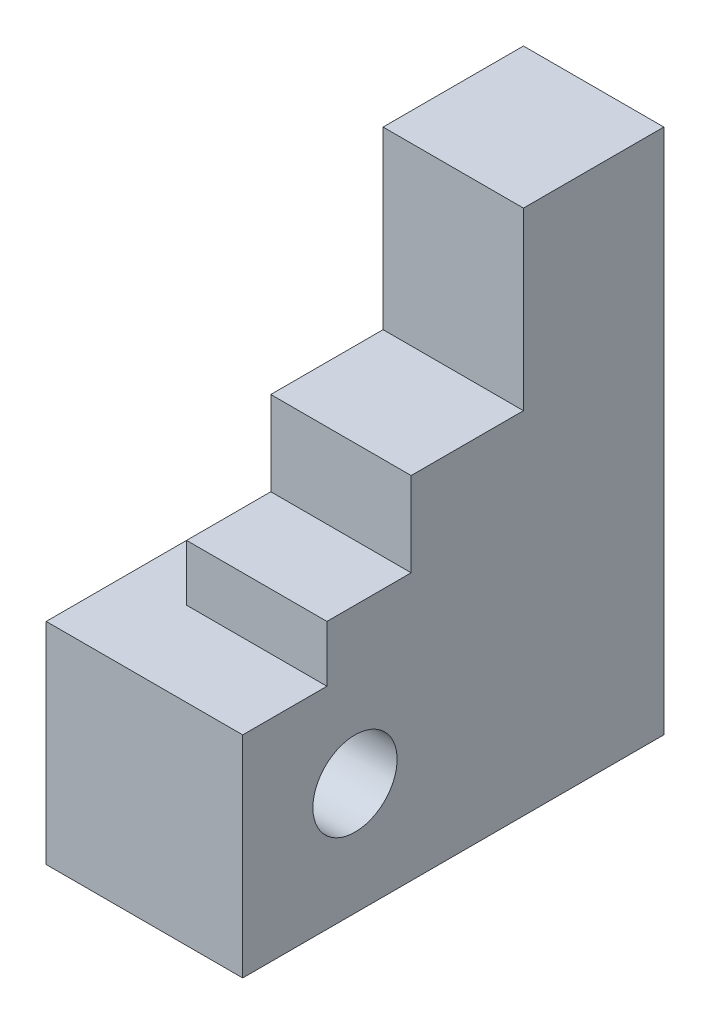
ISO-10303-21;
HEADER;
FILE_DESCRIPTION(('STEP AP214'),'2;1');
FILE_NAME('part.step','',(''),(''),'','','');
FILE_SCHEMA(('AUTOMOTIVE_DESIGN { 1 0 10303 214 1 1 1 1 }'));
ENDSEC;
DATA;
#1=APPLICATION_CONTEXT('core data for automotive mechanical design processes');
#2=APPLICATION_PROTOCOL_DEFINITION('international standard','automotive_design',2000,#1);
#3=PRODUCT_CONTEXT('',#1,'mechanical');
#4=PRODUCT('Part','Part','',(#3));
#5=PRODUCT_RELATED_PRODUCT_CATEGORY('part','',(#4));
#6=PRODUCT_DEFINITION_FORMATION('','',#4);
#7=PRODUCT_DEFINITION_CONTEXT('part definition',#1,'design');
#8=PRODUCT_DEFINITION('design','',#6,#7);
#9=PRODUCT_DEFINITION_SHAPE('','',#8);
#10=(LENGTH_UNIT() NAMED_UNIT(*) SI_UNIT(.MILLI.,.METRE.));
#11=(NAMED_UNIT(*) PLANE_ANGLE_UNIT() SI_UNIT($,.RADIAN.));
#12=(NAMED_UNIT(*) SI_UNIT($,.STERADIAN.) SOLID_ANGLE_UNIT());
#13=UNCERTAINTY_MEASURE_WITH_UNIT(LENGTH_MEASURE(1.E-05),#10,'distance_accuracy_value','');
#14=(GEOMETRIC_REPRESENTATION_CONTEXT(3) GLOBAL_UNCERTAINTY_ASSIGNED_CONTEXT((#13)) GLOBAL_UNIT_ASSIGNED_CONTEXT((#10,
#11,#12)) REPRESENTATION_CONTEXT('',''));
#15=CARTESIAN_POINT('',(0.,0.,0.));
#16=DIRECTION('',(0.,0.,1.));
#17=DIRECTION('',(1.,0.,0.));
#18=AXIS2_PLACEMENT_3D('',#15,#16,#17);
#19=CARTESIAN_POINT('',(0.,50.,0.));
#20=DIRECTION('',(0.,-1.,0.));
#21=DIRECTION('',(0.,0.,-1.));
#22=AXIS2_PLACEMENT_3D('',#19,#20,#21);
#23=PLANE('',#22);
#24=DIRECTION('',(1.,0.,0.));
#25=VECTOR('',#24,1.);
#26=CARTESIAN_POINT('',(14.,50.,-10.));
#27=LINE('',#26,#25);
#28=CARTESIAN_POINT('',(-6.,50.,-10.));
#29=VERTEX_POINT('',#28);
#30=CARTESIAN_POINT('',(14.,50.,-10.));
#31=VERTEX_POINT('',#30);
#32=EDGE_CURVE('E54',#29,#31,#27,.T.);
#33=ORIENTED_EDGE('',*,*,#32,.F.);
#34=DIRECTION('',(0.,0.,1.));
#35=VECTOR('',#34,1.);
#36=CARTESIAN_POINT('',(-6.,50.,-30.));
#37=LINE('',#36,#35);
#38=CARTESIAN_POINT('',(-6.,50.,5.99999999999999));
#39=VERTEX_POINT('',#38);
#40=EDGE_CURVE('E159',#29,#39,#37,.T.);
#41=ORIENTED_EDGE('',*,*,#40,.T.);
#42=DIRECTION('',(1.,0.,0.));
#43=VECTOR('',#42,1.);
#44=CARTESIAN_POINT('',(14.,50.,5.99999999999999));
#45=LINE('',#44,#43);
#46=CARTESIAN_POINT('',(14.,50.,5.99999999999999));
#47=VERTEX_POINT('',#46);
#48=EDGE_CURVE('E161',#39,#47,#45,.T.);
#49=ORIENTED_EDGE('',*,*,#48,.T.);
#50=DIRECTION('',(0.,0.,-1.));
#51=VECTOR('',#50,1.);
#52=CARTESIAN_POINT('',(14.,50.,-30.));
#53=LINE('',#52,#51);
#54=EDGE_CURVE('E157',#47,#31,#53,.T.);
#55=ORIENTED_EDGE('',*,*,#54,.T.);
#56=EDGE_LOOP('',(#33,#41,#49,#55));
#57=FACE_BOUND('',#56,.T.);
#58=ADVANCED_FACE('F39',(#57),#23,.F.);
#59=CARTESIAN_POINT('',(0.,38.,0.));
#60=DIRECTION('',(0.,-1.,0.));
#61=DIRECTION('',(0.,0.,-1.));
#62=AXIS2_PLACEMENT_3D('',#59,#60,#61);
#63=PLANE('',#62);
#64=DIRECTION('',(1.,0.,0.));
#65=VECTOR('',#64,1.);
#66=CARTESIAN_POINT('',(14.,38.,5.99999999999999));
#67=LINE('',#66,#65);
#68=CARTESIAN_POINT('',(-6.,38.,5.99999999999999));
#69=VERTEX_POINT('',#68);
#70=CARTESIAN_POINT('',(14.,38.,5.99999999999999));
#71=VERTEX_POINT('',#70);
#72=EDGE_CURVE('E62',#69,#71,#67,.T.);
#73=ORIENTED_EDGE('',*,*,#72,.F.);
#74=DIRECTION('',(0.,0.,1.));
#75=VECTOR('',#74,1.);
#76=CARTESIAN_POINT('',(-6.,38.,-30.));
#77=LINE('',#76,#75);
#78=CARTESIAN_POINT('',(-5.99999999999999,38.,18.));
#79=VERTEX_POINT('',#78);
#80=EDGE_CURVE('E173',#69,#79,#77,.T.);
#81=ORIENTED_EDGE('',*,*,#80,.T.);
#82=DIRECTION('',(1.,0.,0.));
#83=VECTOR('',#82,1.);
#84=CARTESIAN_POINT('',(14.,38.,18.));
#85=LINE('',#84,#83);
#86=CARTESIAN_POINT('',(14.,38.,18.));
#87=VERTEX_POINT('',#86);
#88=EDGE_CURVE('E176',#79,#87,#85,.T.);
#89=ORIENTED_EDGE('',*,*,#88,.T.);
#90=DIRECTION('',(0.,0.,-1.));
#91=VECTOR('',#90,1.);
#92=CARTESIAN_POINT('',(14.,38.,-30.));
#93=LINE('',#92,#91);
#94=EDGE_CURVE('E171',#87,#71,#93,.T.);
#95=ORIENTED_EDGE('',*,*,#94,.T.);
#96=EDGE_LOOP('',(#73,#81,#89,#95));
#97=FACE_BOUND('',#96,.T.);
#98=ADVANCED_FACE('F254',(#97),#63,.F.);
#99=CARTESIAN_POINT('',(14.,30.,-30.));
#100=DIRECTION('',(-1.,0.,0.));
#101=DIRECTION('',(0.,0.,1.));
#102=AXIS2_PLACEMENT_3D('',#99,#100,#101);
#103=PLANE('',#102);
#104=CARTESIAN_POINT('',(14.,16.,14.));
#105=DIRECTION('',(-1.,0.,0.));
#106=DIRECTION('',(0.,0.,1.));
#107=AXIS2_PLACEMENT_3D('',#104,#105,#106);
#108=CIRCLE('',#107,6.);
#109=CARTESIAN_POINT('',(14.,16.,20.));
#110=VERTEX_POINT('',#109);
#111=EDGE_CURVE('E145',#110,#110,#108,.T.);
#112=ORIENTED_EDGE('',*,*,#111,.T.);
#113=EDGE_LOOP('',(#112));
#114=FACE_BOUND('',#113,.T.);
#115=DIRECTION('',(0.,0.,-1.));
#116=VECTOR('',#115,1.);
#117=CARTESIAN_POINT('',(14.,0.,-30.));
#118=LINE('',#117,#116);
#119=CARTESIAN_POINT('',(14.,0.,30.));
#120=VERTEX_POINT('',#119);
#121=CARTESIAN_POINT('',(14.,0.,-30.));
#122=VERTEX_POINT('',#121);
#123=EDGE_CURVE('E128',#120,#122,#118,.T.);
#124=ORIENTED_EDGE('',*,*,#123,.T.);
#125=DIRECTION('',(0.,-1.,0.));
#126=VECTOR('',#125,1.);
#127=CARTESIAN_POINT('',(14.,30.,-30.));
#128=LINE('',#127,#126);
#129=CARTESIAN_POINT('',(14.,75.,-30.));
#130=VERTEX_POINT('',#129);
#131=EDGE_CURVE('E11',#130,#122,#128,.T.);
#132=ORIENTED_EDGE('',*,*,#131,.F.);
#133=DIRECTION('',(0.,0.,-1.));
#134=VECTOR('',#133,1.);
#135=CARTESIAN_POINT('',(14.,75.,-30.));
#136=LINE('',#135,#134);
#137=CARTESIAN_POINT('',(14.,75.,-10.));
#138=VERTEX_POINT('',#137);
#139=EDGE_CURVE('E125',#138,#130,#136,.T.);
#140=ORIENTED_EDGE('',*,*,#139,.F.);
#141=DIRECTION('',(0.,-1.,0.));
#142=VECTOR('',#141,1.);
#143=CARTESIAN_POINT('',(14.,75.,-10.));
#144=LINE('',#143,#142);
#145=EDGE_CURVE('E151',#138,#31,#144,.T.);
#146=ORIENTED_EDGE('',*,*,#145,.T.);
#147=ORIENTED_EDGE('',*,*,#54,.F.);
#148=DIRECTION('',(0.,-1.,0.));
#149=VECTOR('',#148,1.);
#150=CARTESIAN_POINT('',(14.,50.,5.99999999999999));
#151=LINE('',#150,#149);
#152=EDGE_CURVE('E163',#47,#71,#151,.T.);
#153=ORIENTED_EDGE('',*,*,#152,.T.);
#154=ORIENTED_EDGE('',*,*,#94,.F.);
#155=DIRECTION('',(0.,-1.,0.));
#156=VECTOR('',#155,1.);
#157=CARTESIAN_POINT('',(14.,38.,18.));
#158=LINE('',#157,#156);
#159=CARTESIAN_POINT('',(14.,30.,18.));
#160=VERTEX_POINT('',#159);
#161=EDGE_CURVE('E178',#87,#160,#158,.T.);
#162=ORIENTED_EDGE('',*,*,#161,.T.);
#163=DIRECTION('',(0.,0.,-1.));
#164=VECTOR('',#163,1.);
#165=CARTESIAN_POINT('',(14.,30.,-30.));
#166=LINE('',#165,#164);
#167=CARTESIAN_POINT('',(14.,30.,30.));
#168=VERTEX_POINT('',#167);
#169=EDGE_CURVE('E189',#168,#160,#166,.T.);
#170=ORIENTED_EDGE('',*,*,#169,.F.);
#171=DIRECTION('',(0.,-1.,0.));
#172=VECTOR('',#171,1.);
#173=CARTESIAN_POINT('',(14.,30.,30.));
#174=LINE('',#173,#172);
#175=EDGE_CURVE('E198',#168,#120,#174,.T.);
#176=ORIENTED_EDGE('',*,*,#175,.T.);
#177=EDGE_LOOP('',(#124,#132,#140,#146,#147,#153,#154,#162,#170,#176));
#178=FACE_BOUND('',#177,.T.);
#179=ADVANCED_FACE('F41',(#114,#178),#103,.F.);
#180=CARTESIAN_POINT('',(-14.,30.,-30.));
#181=DIRECTION('',(0.,0.,1.));
#182=DIRECTION('',(1.,0.,0.));
#183=AXIS2_PLACEMENT_3D('',#180,#181,#182);
#184=PLANE('',#183);
#185=DIRECTION('',(-1.,0.,0.));
#186=VECTOR('',#185,1.);
#187=CARTESIAN_POINT('',(-14.,0.,-30.));
#188=LINE('',#187,#186);
#189=CARTESIAN_POINT('',(-14.,0.,-30.));
#190=VERTEX_POINT('',#189);
#191=EDGE_CURVE('E200',#122,#190,#188,.T.);
#192=ORIENTED_EDGE('',*,*,#191,.T.);
#193=DIRECTION('',(0.,-1.,0.));
#194=VECTOR('',#193,1.);
#195=CARTESIAN_POINT('',(-14.,30.,-30.));
#196=LINE('',#195,#194);
#197=CARTESIAN_POINT('',(-14.,30.,-30.));
#198=VERTEX_POINT('',#197);
#199=EDGE_CURVE('E47',#198,#190,#196,.T.);
#200=ORIENTED_EDGE('',*,*,#199,.F.);
#201=DIRECTION('',(-1.,0.,0.));
#202=VECTOR('',#201,1.);
#203=CARTESIAN_POINT('',(-14.,30.,-30.));
#204=LINE('',#203,#202);
#205=CARTESIAN_POINT('',(-6.,30.,-30.));
#206=VERTEX_POINT('',#205);
#207=EDGE_CURVE('E191',#206,#198,#204,.T.);
#208=ORIENTED_EDGE('',*,*,#207,.F.);
#209=DIRECTION('',(0.,-1.,0.));
#210=VECTOR('',#209,1.);
#211=CARTESIAN_POINT('',(-6.,38.,-30.));
#212=LINE('',#211,#210);
#213=CARTESIAN_POINT('',(-6.,75.,-30.));
#214=VERTEX_POINT('',#213);
#215=EDGE_CURVE('E135',#214,#206,#212,.T.);
#216=ORIENTED_EDGE('',*,*,#215,.F.);
#217=DIRECTION('',(-1.,0.,0.));
#218=VECTOR('',#217,1.);
#219=CARTESIAN_POINT('',(14.,75.,-30.));
#220=LINE('',#219,#218);
#221=EDGE_CURVE('E131',#130,#214,#220,.T.);
#222=ORIENTED_EDGE('',*,*,#221,.F.);
#223=ORIENTED_EDGE('',*,*,#131,.T.);
#224=EDGE_LOOP('',(#192,#200,#208,#216,#222,#223));
#225=FACE_BOUND('',#224,.T.);
#226=ADVANCED_FACE('F132',(#225),#184,.F.);
#227=CARTESIAN_POINT('',(-14.,30.,-30.));
#228=DIRECTION('',(1.,0.,0.));
#229=DIRECTION('',(0.,0.,-1.));
#230=AXIS2_PLACEMENT_3D('',#227,#228,#229);
#231=PLANE('',#230);
#232=CARTESIAN_POINT('',(-14.,16.,14.));
#233=DIRECTION('',(-1.,0.,0.));
#234=DIRECTION('',(0.,0.,1.));
#235=AXIS2_PLACEMENT_3D('',#232,#233,#234);
#236=CIRCLE('',#235,6.);
#237=CARTESIAN_POINT('',(-14.,16.,20.));
#238=VERTEX_POINT('',#237);
#239=EDGE_CURVE('E270',#238,#238,#236,.T.);
#240=ORIENTED_EDGE('',*,*,#239,.F.);
#241=EDGE_LOOP('',(#240));
#242=FACE_BOUND('',#241,.T.);
#243=DIRECTION('',(0.,0.,1.));
#244=VECTOR('',#243,1.);
#245=CARTESIAN_POINT('',(-14.,0.,-30.));
#246=LINE('',#245,#244);
#247=CARTESIAN_POINT('',(-14.,0.,30.));
#248=VERTEX_POINT('',#247);
#249=EDGE_CURVE('E202',#190,#248,#246,.T.);
#250=ORIENTED_EDGE('',*,*,#249,.T.);
#251=DIRECTION('',(0.,-1.,0.));
#252=VECTOR('',#251,1.);
#253=CARTESIAN_POINT('',(-14.,30.,30.));
#254=LINE('',#253,#252);
#255=CARTESIAN_POINT('',(-14.,30.,30.));
#256=VERTEX_POINT('',#255);
#257=EDGE_CURVE('E206',#256,#248,#254,.T.);
#258=ORIENTED_EDGE('',*,*,#257,.F.);
#259=DIRECTION('',(0.,0.,1.));
#260=VECTOR('',#259,1.);
#261=CARTESIAN_POINT('',(-14.,30.,-30.));
#262=LINE('',#261,#260);
#263=EDGE_CURVE('E194',#198,#256,#262,.T.);
#264=ORIENTED_EDGE('',*,*,#263,.F.);
#265=ORIENTED_EDGE('',*,*,#199,.T.);
#266=EDGE_LOOP('',(#250,#258,#264,#265));
#267=FACE_BOUND('',#266,.T.);
#268=ADVANCED_FACE('F213',(#242,#267),#231,.F.);
#269=CARTESIAN_POINT('',(-14.,30.,30.));
#270=DIRECTION('',(0.,0.,-1.));
#271=DIRECTION('',(-1.,0.,0.));
#272=AXIS2_PLACEMENT_3D('',#269,#270,#271);
#273=PLANE('',#272);
#274=DIRECTION('',(1.,0.,0.));
#275=VECTOR('',#274,1.);
#276=CARTESIAN_POINT('',(-14.,0.,30.));
#277=LINE('',#276,#275);
#278=EDGE_CURVE('E192',#248,#120,#277,.T.);
#279=ORIENTED_EDGE('',*,*,#278,.T.);
#280=ORIENTED_EDGE('',*,*,#175,.F.);
#281=DIRECTION('',(1.,0.,0.));
#282=VECTOR('',#281,1.);
#283=CARTESIAN_POINT('',(-14.,30.,30.));
#284=LINE('',#283,#282);
#285=EDGE_CURVE('E196',#256,#168,#284,.T.);
#286=ORIENTED_EDGE('',*,*,#285,.F.);
#287=ORIENTED_EDGE('',*,*,#257,.T.);
#288=EDGE_LOOP('',(#279,#280,#286,#287));
#289=FACE_BOUND('',#288,.T.);
#290=ADVANCED_FACE('F220',(#289),#273,.F.);
#291=CARTESIAN_POINT('',(0.,30.,0.));
#292=DIRECTION('',(0.,1.,0.));
#293=DIRECTION('',(0.,0.,1.));
#294=AXIS2_PLACEMENT_3D('',#291,#292,#293);
#295=PLANE('',#294);
#296=DIRECTION('',(1.,0.,0.));
#297=VECTOR('',#296,1.);
#298=CARTESIAN_POINT('',(14.,30.,18.));
#299=LINE('',#298,#297);
#300=CARTESIAN_POINT('',(-5.99999999999999,30.,18.));
#301=VERTEX_POINT('',#300);
#302=EDGE_CURVE('E174',#301,#160,#299,.T.);
#303=ORIENTED_EDGE('',*,*,#302,.F.);
#304=DIRECTION('',(0.,0.,1.));
#305=VECTOR('',#304,1.);
#306=CARTESIAN_POINT('',(-6.,30.,-30.));
#307=LINE('',#306,#305);
#308=EDGE_CURVE('E170',#206,#301,#307,.T.);
#309=ORIENTED_EDGE('',*,*,#308,.F.);
#310=ORIENTED_EDGE('',*,*,#207,.T.);
#311=ORIENTED_EDGE('',*,*,#263,.T.);
#312=ORIENTED_EDGE('',*,*,#285,.T.);
#313=ORIENTED_EDGE('',*,*,#169,.T.);
#314=EDGE_LOOP('',(#303,#309,#310,#311,#312,#313));
#315=FACE_BOUND('',#314,.T.);
#316=ADVANCED_FACE('F226',(#315),#295,.T.);
#317=CARTESIAN_POINT('',(0.,0.,0.));
#318=DIRECTION('',(0.,1.,0.));
#319=DIRECTION('',(0.,0.,1.));
#320=AXIS2_PLACEMENT_3D('',#317,#318,#319);
#321=PLANE('',#320);
#322=ORIENTED_EDGE('',*,*,#123,.F.);
#323=ORIENTED_EDGE('',*,*,#278,.F.);
#324=ORIENTED_EDGE('',*,*,#249,.F.);
#325=ORIENTED_EDGE('',*,*,#191,.F.);
#326=EDGE_LOOP('',(#322,#323,#324,#325));
#327=FACE_BOUND('',#326,.T.);
#328=ADVANCED_FACE('F217',(#327),#321,.F.);
#329=CARTESIAN_POINT('',(-6.,38.,-30.));
#330=DIRECTION('',(1.,0.,0.));
#331=DIRECTION('',(0.,0.,-1.));
#332=AXIS2_PLACEMENT_3D('',#329,#330,#331);
#333=PLANE('',#332);
#334=ORIENTED_EDGE('',*,*,#308,.T.);
#335=DIRECTION('',(0.,-1.,0.));
#336=VECTOR('',#335,1.);
#337=CARTESIAN_POINT('',(-5.99999999999999,38.,18.));
#338=LINE('',#337,#336);
#339=EDGE_CURVE('E185',#79,#301,#338,.T.);
#340=ORIENTED_EDGE('',*,*,#339,.F.);
#341=ORIENTED_EDGE('',*,*,#80,.F.);
#342=DIRECTION('',(0.,-1.,0.));
#343=VECTOR('',#342,1.);
#344=CARTESIAN_POINT('',(-6.,50.,5.99999999999999));
#345=LINE('',#344,#343);
#346=EDGE_CURVE('E167',#39,#69,#345,.T.);
#347=ORIENTED_EDGE('',*,*,#346,.F.);
#348=ORIENTED_EDGE('',*,*,#40,.F.);
#349=DIRECTION('',(0.,-1.,0.));
#350=VECTOR('',#349,1.);
#351=CARTESIAN_POINT('',(-6.,75.,-10.));
#352=LINE('',#351,#350);
#353=CARTESIAN_POINT('',(-6.,75.,-10.));
#354=VERTEX_POINT('',#353);
#355=EDGE_CURVE('E154',#354,#29,#352,.T.);
#356=ORIENTED_EDGE('',*,*,#355,.F.);
#357=DIRECTION('',(0.,0.,1.));
#358=VECTOR('',#357,1.);
#359=CARTESIAN_POINT('',(-6.,75.,-30.));
#360=LINE('',#359,#358);
#361=EDGE_CURVE('E138',#214,#354,#360,.T.);
#362=ORIENTED_EDGE('',*,*,#361,.F.);
#363=ORIENTED_EDGE('',*,*,#215,.T.);
#364=EDGE_LOOP('',(#334,#340,#341,#347,#348,#356,#362,#363));
#365=FACE_BOUND('',#364,.T.);
#366=ADVANCED_FACE('F232',(#365),#333,.F.);
#367=CARTESIAN_POINT('',(14.,38.,18.));
#368=DIRECTION('',(0.,0.,-1.));
#369=DIRECTION('',(-1.,0.,0.));
#370=AXIS2_PLACEMENT_3D('',#367,#368,#369);
#371=PLANE('',#370);
#372=ORIENTED_EDGE('',*,*,#302,.T.);
#373=ORIENTED_EDGE('',*,*,#161,.F.);
#374=ORIENTED_EDGE('',*,*,#88,.F.);
#375=ORIENTED_EDGE('',*,*,#339,.T.);
#376=EDGE_LOOP('',(#372,#373,#374,#375));
#377=FACE_BOUND('',#376,.T.);
#378=ADVANCED_FACE('F228',(#377),#371,.F.);
#379=CARTESIAN_POINT('',(14.,50.,5.99999999999999));
#380=DIRECTION('',(0.,0.,-1.));
#381=DIRECTION('',(-1.,0.,0.));
#382=AXIS2_PLACEMENT_3D('',#379,#380,#381);
#383=PLANE('',#382);
#384=ORIENTED_EDGE('',*,*,#72,.T.);
#385=ORIENTED_EDGE('',*,*,#152,.F.);
#386=ORIENTED_EDGE('',*,*,#48,.F.);
#387=ORIENTED_EDGE('',*,*,#346,.T.);
#388=EDGE_LOOP('',(#384,#385,#386,#387));
#389=FACE_BOUND('',#388,.T.);
#390=ADVANCED_FACE('F241',(#389),#383,.F.);
#391=CARTESIAN_POINT('',(14.,75.,-10.));
#392=DIRECTION('',(0.,0.,-1.));
#393=DIRECTION('',(-1.,0.,0.));
#394=AXIS2_PLACEMENT_3D('',#391,#392,#393);
#395=PLANE('',#394);
#396=ORIENTED_EDGE('',*,*,#32,.T.);
#397=ORIENTED_EDGE('',*,*,#145,.F.);
#398=DIRECTION('',(1.,0.,0.));
#399=VECTOR('',#398,1.);
#400=CARTESIAN_POINT('',(14.,75.,-10.));
#401=LINE('',#400,#399);
#402=EDGE_CURVE('E142',#354,#138,#401,.T.);
#403=ORIENTED_EDGE('',*,*,#402,.F.);
#404=ORIENTED_EDGE('',*,*,#355,.T.);
#405=EDGE_LOOP('',(#396,#397,#403,#404));
#406=FACE_BOUND('',#405,.T.);
#407=ADVANCED_FACE('F236',(#406),#395,.F.);
#408=CARTESIAN_POINT('',(0.,75.,0.));
#409=DIRECTION('',(0.,-1.,0.));
#410=DIRECTION('',(0.,0.,-1.));
#411=AXIS2_PLACEMENT_3D('',#408,#409,#410);
#412=PLANE('',#411);
#413=ORIENTED_EDGE('',*,*,#139,.T.);
#414=ORIENTED_EDGE('',*,*,#221,.T.);
#415=ORIENTED_EDGE('',*,*,#361,.T.);
#416=ORIENTED_EDGE('',*,*,#402,.T.);
#417=EDGE_LOOP('',(#413,#414,#415,#416));
#418=FACE_BOUND('',#417,.T.);
#419=ADVANCED_FACE('F140',(#418),#412,.F.);
#420=CARTESIAN_POINT('',(21.,16.,14.));
#421=DIRECTION('',(-1.,0.,0.));
#422=DIRECTION('',(0.,0.,1.));
#423=AXIS2_PLACEMENT_3D('',#420,#421,#422);
#424=CYLINDRICAL_SURFACE('',#423,6.);
#425=ORIENTED_EDGE('',*,*,#239,.T.);
#426=EDGE_LOOP('',(#425));
#427=FACE_BOUND('',#426,.T.);
#428=ORIENTED_EDGE('',*,*,#111,.F.);
#429=EDGE_LOOP('',(#428));
#430=FACE_BOUND('',#429,.T.);
#431=ADVANCED_FACE('F261',(#427,#430),#424,.F.);
#432=CLOSED_SHELL('',(#58,#98,#179,#226,#268,#290,#316,#328,#366,#378,#390,#407,#419,#431));
#433=MANIFOLD_SOLID_BREP('B2',#432);
#434=ADVANCED_BREP_SHAPE_REPRESENTATION('',(#18,#433),#14);
#435=SHAPE_DEFINITION_REPRESENTATION(#9,#434);
ENDSEC;
END-ISO-10303-21;
